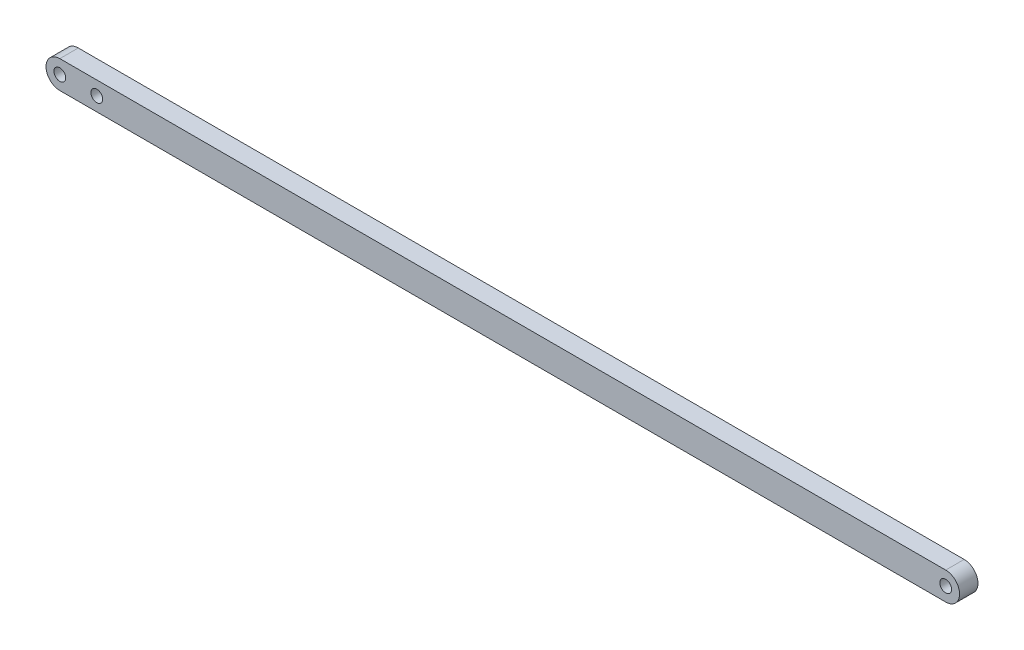
ISO-10303-21;
HEADER;
FILE_DESCRIPTION(('STEP AP214'),'2;1');
FILE_NAME('part.step','',(''),(''),'','','');
FILE_SCHEMA(('AUTOMOTIVE_DESIGN { 1 0 10303 214 1 1 1 1 }'));
ENDSEC;
DATA;
#1=APPLICATION_CONTEXT('core data for automotive mechanical design processes');
#2=APPLICATION_PROTOCOL_DEFINITION('international standard','automotive_design',2000,#1);
#3=PRODUCT_CONTEXT('',#1,'mechanical');
#4=PRODUCT('Part','Part','',(#3));
#5=PRODUCT_RELATED_PRODUCT_CATEGORY('part','',(#4));
#6=PRODUCT_DEFINITION_FORMATION('','',#4);
#7=PRODUCT_DEFINITION_CONTEXT('part definition',#1,'design');
#8=PRODUCT_DEFINITION('design','',#6,#7);
#9=PRODUCT_DEFINITION_SHAPE('','',#8);
#10=(LENGTH_UNIT() NAMED_UNIT(*) SI_UNIT(.MILLI.,.METRE.));
#11=(NAMED_UNIT(*) PLANE_ANGLE_UNIT() SI_UNIT($,.RADIAN.));
#12=(NAMED_UNIT(*) SI_UNIT($,.STERADIAN.) SOLID_ANGLE_UNIT());
#13=UNCERTAINTY_MEASURE_WITH_UNIT(LENGTH_MEASURE(1.E-05),#10,'distance_accuracy_value','');
#14=(GEOMETRIC_REPRESENTATION_CONTEXT(3) GLOBAL_UNCERTAINTY_ASSIGNED_CONTEXT((#13)) GLOBAL_UNIT_ASSIGNED_CONTEXT((#10,
#11,#12)) REPRESENTATION_CONTEXT('',''));
#15=CARTESIAN_POINT('',(0.,0.,0.));
#16=DIRECTION('',(0.,0.,1.));
#17=DIRECTION('',(1.,0.,0.));
#18=AXIS2_PLACEMENT_3D('',#15,#16,#17);
#19=CARTESIAN_POINT('',(0.,0.,6.35));
#20=DIRECTION('',(0.,0.,1.));
#21=DIRECTION('',(1.,0.,0.));
#22=AXIS2_PLACEMENT_3D('',#19,#20,#21);
#23=PLANE('',#22);
#24=CARTESIAN_POINT('',(304.8,0.,6.35));
#25=DIRECTION('',(0.,0.,1.));
#26=DIRECTION('',(1.,0.,0.));
#27=AXIS2_PLACEMENT_3D('',#24,#25,#26);
#28=CIRCLE('',#27,2.03199999999995);
#29=CARTESIAN_POINT('',(306.832,0.,6.35));
#30=VERTEX_POINT('',#29);
#31=EDGE_CURVE('E140',#30,#30,#28,.T.);
#32=ORIENTED_EDGE('',*,*,#31,.F.);
#33=EDGE_LOOP('',(#32));
#34=FACE_BOUND('',#33,.T.);
#35=CARTESIAN_POINT('',(0.,0.,6.35));
#36=DIRECTION('',(0.,0.,1.));
#37=DIRECTION('',(1.,0.,0.));
#38=AXIS2_PLACEMENT_3D('',#35,#36,#37);
#39=CIRCLE('',#38,4.7625);
#40=CARTESIAN_POINT('',(0.,4.7625,6.35));
#41=VERTEX_POINT('',#40);
#42=CARTESIAN_POINT('',(0.,-4.7625,6.35));
#43=VERTEX_POINT('',#42);
#44=EDGE_CURVE('E98',#41,#43,#39,.T.);
#45=ORIENTED_EDGE('',*,*,#44,.T.);
#46=DIRECTION('',(1.,0.,0.));
#47=VECTOR('',#46,1.);
#48=CARTESIAN_POINT('',(0.,-4.7625,6.35));
#49=LINE('',#48,#47);
#50=CARTESIAN_POINT('',(304.8,-4.7625,6.35));
#51=VERTEX_POINT('',#50);
#52=EDGE_CURVE('E93',#43,#51,#49,.T.);
#53=ORIENTED_EDGE('',*,*,#52,.T.);
#54=CARTESIAN_POINT('',(304.8,0.,6.35));
#55=DIRECTION('',(0.,0.,1.));
#56=DIRECTION('',(1.,0.,0.));
#57=AXIS2_PLACEMENT_3D('',#54,#55,#56);
#58=CIRCLE('',#57,4.7625);
#59=CARTESIAN_POINT('',(304.8,4.7625,6.35));
#60=VERTEX_POINT('',#59);
#61=EDGE_CURVE('E96',#51,#60,#58,.T.);
#62=ORIENTED_EDGE('',*,*,#61,.T.);
#63=DIRECTION('',(-1.,0.,0.));
#64=VECTOR('',#63,1.);
#65=CARTESIAN_POINT('',(0.,4.7625,6.35));
#66=LINE('',#65,#64);
#67=EDGE_CURVE('E63',#60,#41,#66,.T.);
#68=ORIENTED_EDGE('',*,*,#67,.T.);
#69=EDGE_LOOP('',(#45,#53,#62,#68));
#70=FACE_BOUND('',#69,.T.);
#71=CARTESIAN_POINT('',(0.,0.,6.35));
#72=DIRECTION('',(0.,0.,1.));
#73=DIRECTION('',(1.,0.,0.));
#74=AXIS2_PLACEMENT_3D('',#71,#72,#73);
#75=CIRCLE('',#74,2.032);
#76=CARTESIAN_POINT('',(2.032,0.,6.35));
#77=VERTEX_POINT('',#76);
#78=EDGE_CURVE('E118',#77,#77,#75,.T.);
#79=ORIENTED_EDGE('',*,*,#78,.F.);
#80=EDGE_LOOP('',(#79));
#81=FACE_BOUND('',#80,.T.);
#82=CARTESIAN_POINT('',(12.7,0.,6.35));
#83=DIRECTION('',(0.,0.,1.));
#84=DIRECTION('',(1.,0.,0.));
#85=AXIS2_PLACEMENT_3D('',#82,#83,#84);
#86=CIRCLE('',#85,2.032);
#87=CARTESIAN_POINT('',(14.732,0.,6.35));
#88=VERTEX_POINT('',#87);
#89=EDGE_CURVE('E148',#88,#88,#86,.T.);
#90=ORIENTED_EDGE('',*,*,#89,.F.);
#91=EDGE_LOOP('',(#90));
#92=FACE_BOUND('',#91,.T.);
#93=ADVANCED_FACE('F45',(#34,#70,#81,#92),#23,.T.);
#94=CARTESIAN_POINT('',(0.,0.,0.));
#95=DIRECTION('',(0.,0.,1.));
#96=DIRECTION('',(1.,0.,0.));
#97=AXIS2_PLACEMENT_3D('',#94,#95,#96);
#98=PLANE('',#97);
#99=CARTESIAN_POINT('',(0.,0.,0.));
#100=DIRECTION('',(0.,0.,1.));
#101=DIRECTION('',(1.,0.,0.));
#102=AXIS2_PLACEMENT_3D('',#99,#100,#101);
#103=CIRCLE('',#102,4.7625);
#104=CARTESIAN_POINT('',(0.,4.7625,0.));
#105=VERTEX_POINT('',#104);
#106=CARTESIAN_POINT('',(0.,-4.7625,0.));
#107=VERTEX_POINT('',#106);
#108=EDGE_CURVE('E114',#105,#107,#103,.T.);
#109=ORIENTED_EDGE('',*,*,#108,.F.);
#110=DIRECTION('',(-1.,0.,0.));
#111=VECTOR('',#110,1.);
#112=CARTESIAN_POINT('',(0.,4.7625,0.));
#113=LINE('',#112,#111);
#114=CARTESIAN_POINT('',(304.8,4.7625,0.));
#115=VERTEX_POINT('',#114);
#116=EDGE_CURVE('E86',#115,#105,#113,.T.);
#117=ORIENTED_EDGE('',*,*,#116,.F.);
#118=CARTESIAN_POINT('',(304.8,0.,0.));
#119=DIRECTION('',(0.,0.,1.));
#120=DIRECTION('',(1.,0.,0.));
#121=AXIS2_PLACEMENT_3D('',#118,#119,#120);
#122=CIRCLE('',#121,4.7625);
#123=CARTESIAN_POINT('',(304.8,-4.7625,0.));
#124=VERTEX_POINT('',#123);
#125=EDGE_CURVE('E80',#124,#115,#122,.T.);
#126=ORIENTED_EDGE('',*,*,#125,.F.);
#127=DIRECTION('',(1.,0.,0.));
#128=VECTOR('',#127,1.);
#129=CARTESIAN_POINT('',(0.,-4.7625,0.));
#130=LINE('',#129,#128);
#131=EDGE_CURVE('E103',#107,#124,#130,.T.);
#132=ORIENTED_EDGE('',*,*,#131,.F.);
#133=EDGE_LOOP('',(#109,#117,#126,#132));
#134=FACE_BOUND('',#133,.T.);
#135=CARTESIAN_POINT('',(0.,0.,0.));
#136=DIRECTION('',(0.,0.,1.));
#137=DIRECTION('',(1.,0.,0.));
#138=AXIS2_PLACEMENT_3D('',#135,#136,#137);
#139=CIRCLE('',#138,2.032);
#140=CARTESIAN_POINT('',(2.032,0.,0.));
#141=VERTEX_POINT('',#140);
#142=EDGE_CURVE('E136',#141,#141,#139,.T.);
#143=ORIENTED_EDGE('',*,*,#142,.T.);
#144=EDGE_LOOP('',(#143));
#145=FACE_BOUND('',#144,.T.);
#146=CARTESIAN_POINT('',(304.8,0.,0.));
#147=DIRECTION('',(0.,0.,1.));
#148=DIRECTION('',(1.,0.,0.));
#149=AXIS2_PLACEMENT_3D('',#146,#147,#148);
#150=CIRCLE('',#149,2.03199999999995);
#151=CARTESIAN_POINT('',(306.832,0.,0.));
#152=VERTEX_POINT('',#151);
#153=EDGE_CURVE('E144',#152,#152,#150,.T.);
#154=ORIENTED_EDGE('',*,*,#153,.T.);
#155=EDGE_LOOP('',(#154));
#156=FACE_BOUND('',#155,.T.);
#157=CARTESIAN_POINT('',(12.7,0.,0.));
#158=DIRECTION('',(0.,0.,1.));
#159=DIRECTION('',(1.,0.,0.));
#160=AXIS2_PLACEMENT_3D('',#157,#158,#159);
#161=CIRCLE('',#160,2.032);
#162=CARTESIAN_POINT('',(14.732,0.,0.));
#163=VERTEX_POINT('',#162);
#164=EDGE_CURVE('E152',#163,#163,#161,.T.);
#165=ORIENTED_EDGE('',*,*,#164,.T.);
#166=EDGE_LOOP('',(#165));
#167=FACE_BOUND('',#166,.T.);
#168=ADVANCED_FACE('F131',(#134,#145,#156,#167),#98,.F.);
#169=CARTESIAN_POINT('',(0.,0.,6.35));
#170=DIRECTION('',(0.,0.,-1.));
#171=DIRECTION('',(-1.,0.,0.));
#172=AXIS2_PLACEMENT_3D('',#169,#170,#171);
#173=CYLINDRICAL_SURFACE('',#172,4.7625);
#174=ORIENTED_EDGE('',*,*,#108,.T.);
#175=DIRECTION('',(0.,0.,-1.));
#176=VECTOR('',#175,1.);
#177=CARTESIAN_POINT('',(0.,-4.7625,6.35));
#178=LINE('',#177,#176);
#179=EDGE_CURVE('E11',#43,#107,#178,.T.);
#180=ORIENTED_EDGE('',*,*,#179,.F.);
#181=ORIENTED_EDGE('',*,*,#44,.F.);
#182=DIRECTION('',(0.,0.,-1.));
#183=VECTOR('',#182,1.);
#184=CARTESIAN_POINT('',(0.,4.7625,6.35));
#185=LINE('',#184,#183);
#186=EDGE_CURVE('E110',#41,#105,#185,.T.);
#187=ORIENTED_EDGE('',*,*,#186,.T.);
#188=EDGE_LOOP('',(#174,#180,#181,#187));
#189=FACE_BOUND('',#188,.T.);
#190=ADVANCED_FACE('F47',(#189),#173,.T.);
#191=CARTESIAN_POINT('',(0.,-4.7625,6.35));
#192=DIRECTION('',(0.,1.,0.));
#193=DIRECTION('',(0.,0.,1.));
#194=AXIS2_PLACEMENT_3D('',#191,#192,#193);
#195=PLANE('',#194);
#196=ORIENTED_EDGE('',*,*,#131,.T.);
#197=DIRECTION('',(0.,0.,-1.));
#198=VECTOR('',#197,1.);
#199=CARTESIAN_POINT('',(304.8,-4.7625,6.35));
#200=LINE('',#199,#198);
#201=EDGE_CURVE('E55',#51,#124,#200,.T.);
#202=ORIENTED_EDGE('',*,*,#201,.F.);
#203=ORIENTED_EDGE('',*,*,#52,.F.);
#204=ORIENTED_EDGE('',*,*,#179,.T.);
#205=EDGE_LOOP('',(#196,#202,#203,#204));
#206=FACE_BOUND('',#205,.T.);
#207=ADVANCED_FACE('F102',(#206),#195,.F.);
#208=CARTESIAN_POINT('',(304.8,0.,6.35));
#209=DIRECTION('',(0.,0.,-1.));
#210=DIRECTION('',(-1.,0.,0.));
#211=AXIS2_PLACEMENT_3D('',#208,#209,#210);
#212=CYLINDRICAL_SURFACE('',#211,4.7625);
#213=ORIENTED_EDGE('',*,*,#125,.T.);
#214=DIRECTION('',(0.,0.,-1.));
#215=VECTOR('',#214,1.);
#216=CARTESIAN_POINT('',(304.8,4.7625,6.35));
#217=LINE('',#216,#215);
#218=EDGE_CURVE('E105',#60,#115,#217,.T.);
#219=ORIENTED_EDGE('',*,*,#218,.F.);
#220=ORIENTED_EDGE('',*,*,#61,.F.);
#221=ORIENTED_EDGE('',*,*,#201,.T.);
#222=EDGE_LOOP('',(#213,#219,#220,#221));
#223=FACE_BOUND('',#222,.T.);
#224=ADVANCED_FACE('F106',(#223),#212,.T.);
#225=CARTESIAN_POINT('',(0.,4.7625,6.35));
#226=DIRECTION('',(0.,-1.,0.));
#227=DIRECTION('',(0.,0.,-1.));
#228=AXIS2_PLACEMENT_3D('',#225,#226,#227);
#229=PLANE('',#228);
#230=ORIENTED_EDGE('',*,*,#116,.T.);
#231=ORIENTED_EDGE('',*,*,#186,.F.);
#232=ORIENTED_EDGE('',*,*,#67,.F.);
#233=ORIENTED_EDGE('',*,*,#218,.T.);
#234=EDGE_LOOP('',(#230,#231,#232,#233));
#235=FACE_BOUND('',#234,.T.);
#236=ADVANCED_FACE('F128',(#235),#229,.F.);
#237=CARTESIAN_POINT('',(0.,0.,6.35));
#238=DIRECTION('',(0.,0.,-1.));
#239=DIRECTION('',(-1.,0.,0.));
#240=AXIS2_PLACEMENT_3D('',#237,#238,#239);
#241=CYLINDRICAL_SURFACE('',#240,2.032);
#242=ORIENTED_EDGE('',*,*,#78,.T.);
#243=EDGE_LOOP('',(#242));
#244=FACE_BOUND('',#243,.T.);
#245=ORIENTED_EDGE('',*,*,#142,.F.);
#246=EDGE_LOOP('',(#245));
#247=FACE_BOUND('',#246,.T.);
#248=ADVANCED_FACE('F172',(#244,#247),#241,.F.);
#249=CARTESIAN_POINT('',(304.8,0.,6.35));
#250=DIRECTION('',(0.,0.,-1.));
#251=DIRECTION('',(-1.,0.,0.));
#252=AXIS2_PLACEMENT_3D('',#249,#250,#251);
#253=CYLINDRICAL_SURFACE('',#252,2.03199999999995);
#254=ORIENTED_EDGE('',*,*,#31,.T.);
#255=EDGE_LOOP('',(#254));
#256=FACE_BOUND('',#255,.T.);
#257=ORIENTED_EDGE('',*,*,#153,.F.);
#258=EDGE_LOOP('',(#257));
#259=FACE_BOUND('',#258,.T.);
#260=ADVANCED_FACE('F217',(#256,#259),#253,.F.);
#261=CARTESIAN_POINT('',(12.7,0.,6.35));
#262=DIRECTION('',(0.,0.,-1.));
#263=DIRECTION('',(-1.,0.,0.));
#264=AXIS2_PLACEMENT_3D('',#261,#262,#263);
#265=CYLINDRICAL_SURFACE('',#264,2.032);
#266=ORIENTED_EDGE('',*,*,#89,.T.);
#267=EDGE_LOOP('',(#266));
#268=FACE_BOUND('',#267,.T.);
#269=ORIENTED_EDGE('',*,*,#164,.F.);
#270=EDGE_LOOP('',(#269));
#271=FACE_BOUND('',#270,.T.);
#272=ADVANCED_FACE('F160',(#268,#271),#265,.F.);
#273=CLOSED_SHELL('',(#93,#168,#190,#207,#224,#236,#248,#260,#272));
#274=MANIFOLD_SOLID_BREP('B2',#273);
#275=ADVANCED_BREP_SHAPE_REPRESENTATION('',(#18,#274),#14);
#276=SHAPE_DEFINITION_REPRESENTATION(#9,#275);
ENDSEC;
END-ISO-10303-21;
